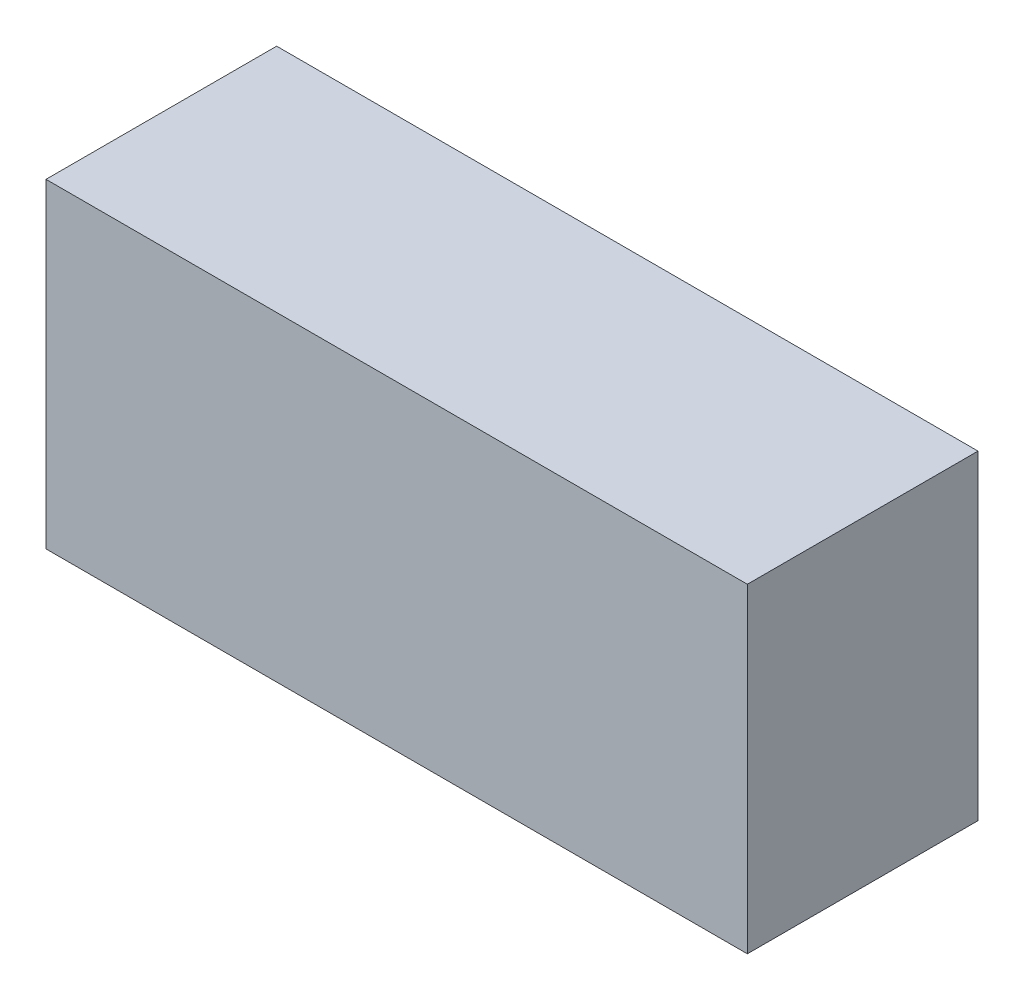
ISO-10303-21;
HEADER;
FILE_DESCRIPTION(('STEP AP214'),'2;1');
FILE_NAME('part.step','',(''),(''),'','','');
FILE_SCHEMA(('AUTOMOTIVE_DESIGN { 1 0 10303 214 1 1 1 1 }'));
ENDSEC;
DATA;
#1=APPLICATION_CONTEXT('core data for automotive mechanical design processes');
#2=APPLICATION_PROTOCOL_DEFINITION('international standard','automotive_design',2000,#1);
#3=PRODUCT_CONTEXT('',#1,'mechanical');
#4=PRODUCT('Part','Part','',(#3));
#5=PRODUCT_RELATED_PRODUCT_CATEGORY('part','',(#4));
#6=PRODUCT_DEFINITION_FORMATION('','',#4);
#7=PRODUCT_DEFINITION_CONTEXT('part definition',#1,'design');
#8=PRODUCT_DEFINITION('design','',#6,#7);
#9=PRODUCT_DEFINITION_SHAPE('','',#8);
#10=(LENGTH_UNIT() NAMED_UNIT(*) SI_UNIT(.MILLI.,.METRE.));
#11=(NAMED_UNIT(*) PLANE_ANGLE_UNIT() SI_UNIT($,.RADIAN.));
#12=(NAMED_UNIT(*) SI_UNIT($,.STERADIAN.) SOLID_ANGLE_UNIT());
#13=UNCERTAINTY_MEASURE_WITH_UNIT(LENGTH_MEASURE(1.E-05),#10,'distance_accuracy_value','');
#14=(GEOMETRIC_REPRESENTATION_CONTEXT(3) GLOBAL_UNCERTAINTY_ASSIGNED_CONTEXT((#13)) GLOBAL_UNIT_ASSIGNED_CONTEXT((#10,
#11,#12)) REPRESENTATION_CONTEXT('',''));
#15=CARTESIAN_POINT('',(0.,0.,0.));
#16=DIRECTION('',(0.,0.,1.));
#17=DIRECTION('',(1.,0.,0.));
#18=AXIS2_PLACEMENT_3D('',#15,#16,#17);
#19=CARTESIAN_POINT('',(-37.25,34.,-12.25));
#20=DIRECTION('',(1.,0.,0.));
#21=DIRECTION('',(0.,0.,-1.));
#22=AXIS2_PLACEMENT_3D('',#19,#20,#21);
#23=PLANE('',#22);
#24=DIRECTION('',(0.,0.,1.));
#25=VECTOR('',#24,1.);
#26=CARTESIAN_POINT('',(-37.25,0.,-12.25));
#27=LINE('',#26,#25);
#28=CARTESIAN_POINT('',(-37.25,0.,-12.25));
#29=VERTEX_POINT('',#28);
#30=CARTESIAN_POINT('',(-37.25,0.,12.25));
#31=VERTEX_POINT('',#30);
#32=EDGE_CURVE('E105',#29,#31,#27,.T.);
#33=ORIENTED_EDGE('',*,*,#32,.T.);
#34=DIRECTION('',(0.,-1.,0.));
#35=VECTOR('',#34,1.);
#36=CARTESIAN_POINT('',(-37.25,34.,12.25));
#37=LINE('',#36,#35);
#38=CARTESIAN_POINT('',(-37.25,34.,12.25));
#39=VERTEX_POINT('',#38);
#40=EDGE_CURVE('E11',#39,#31,#37,.T.);
#41=ORIENTED_EDGE('',*,*,#40,.F.);
#42=DIRECTION('',(0.,0.,1.));
#43=VECTOR('',#42,1.);
#44=CARTESIAN_POINT('',(-37.25,34.,-12.25));
#45=LINE('',#44,#43);
#46=CARTESIAN_POINT('',(-37.25,34.,-12.25));
#47=VERTEX_POINT('',#46);
#48=EDGE_CURVE('E93',#47,#39,#45,.T.);
#49=ORIENTED_EDGE('',*,*,#48,.F.);
#50=DIRECTION('',(0.,-1.,0.));
#51=VECTOR('',#50,1.);
#52=CARTESIAN_POINT('',(-37.25,34.,-12.25));
#53=LINE('',#52,#51);
#54=EDGE_CURVE('E101',#47,#29,#53,.T.);
#55=ORIENTED_EDGE('',*,*,#54,.T.);
#56=EDGE_LOOP('',(#33,#41,#49,#55));
#57=FACE_BOUND('',#56,.T.);
#58=ADVANCED_FACE('F42',(#57),#23,.F.);
#59=CARTESIAN_POINT('',(-37.25,34.,12.25));
#60=DIRECTION('',(0.,0.,-1.));
#61=DIRECTION('',(-1.,0.,0.));
#62=AXIS2_PLACEMENT_3D('',#59,#60,#61);
#63=PLANE('',#62);
#64=DIRECTION('',(1.,0.,0.));
#65=VECTOR('',#64,1.);
#66=CARTESIAN_POINT('',(-37.25,0.,12.25));
#67=LINE('',#66,#65);
#68=CARTESIAN_POINT('',(37.25,0.,12.25));
#69=VERTEX_POINT('',#68);
#70=EDGE_CURVE('E97',#31,#69,#67,.T.);
#71=ORIENTED_EDGE('',*,*,#70,.T.);
#72=DIRECTION('',(0.,-1.,0.));
#73=VECTOR('',#72,1.);
#74=CARTESIAN_POINT('',(37.25,34.,12.25));
#75=LINE('',#74,#73);
#76=CARTESIAN_POINT('',(37.25,34.,12.25));
#77=VERTEX_POINT('',#76);
#78=EDGE_CURVE('E50',#77,#69,#75,.T.);
#79=ORIENTED_EDGE('',*,*,#78,.F.);
#80=DIRECTION('',(1.,0.,0.));
#81=VECTOR('',#80,1.);
#82=CARTESIAN_POINT('',(-37.25,34.,12.25));
#83=LINE('',#82,#81);
#84=EDGE_CURVE('E88',#39,#77,#83,.T.);
#85=ORIENTED_EDGE('',*,*,#84,.F.);
#86=ORIENTED_EDGE('',*,*,#40,.T.);
#87=EDGE_LOOP('',(#71,#79,#85,#86));
#88=FACE_BOUND('',#87,.T.);
#89=ADVANCED_FACE('F96',(#88),#63,.F.);
#90=CARTESIAN_POINT('',(37.25,34.,-12.25));
#91=DIRECTION('',(-1.,0.,0.));
#92=DIRECTION('',(0.,0.,1.));
#93=AXIS2_PLACEMENT_3D('',#90,#91,#92);
#94=PLANE('',#93);
#95=DIRECTION('',(0.,0.,-1.));
#96=VECTOR('',#95,1.);
#97=CARTESIAN_POINT('',(37.25,0.,-12.25));
#98=LINE('',#97,#96);
#99=CARTESIAN_POINT('',(37.25,0.,-12.25));
#100=VERTEX_POINT('',#99);
#101=EDGE_CURVE('E75',#69,#100,#98,.T.);
#102=ORIENTED_EDGE('',*,*,#101,.T.);
#103=DIRECTION('',(0.,-1.,0.));
#104=VECTOR('',#103,1.);
#105=CARTESIAN_POINT('',(37.25,34.,-12.25));
#106=LINE('',#105,#104);
#107=CARTESIAN_POINT('',(37.25,34.,-12.25));
#108=VERTEX_POINT('',#107);
#109=EDGE_CURVE('E98',#108,#100,#106,.T.);
#110=ORIENTED_EDGE('',*,*,#109,.F.);
#111=DIRECTION('',(0.,0.,-1.));
#112=VECTOR('',#111,1.);
#113=CARTESIAN_POINT('',(37.25,34.,-12.25));
#114=LINE('',#113,#112);
#115=EDGE_CURVE('E91',#77,#108,#114,.T.);
#116=ORIENTED_EDGE('',*,*,#115,.F.);
#117=ORIENTED_EDGE('',*,*,#78,.T.);
#118=EDGE_LOOP('',(#102,#110,#116,#117));
#119=FACE_BOUND('',#118,.T.);
#120=ADVANCED_FACE('F99',(#119),#94,.F.);
#121=CARTESIAN_POINT('',(-37.25,34.,-12.25));
#122=DIRECTION('',(0.,0.,1.));
#123=DIRECTION('',(1.,0.,0.));
#124=AXIS2_PLACEMENT_3D('',#121,#122,#123);
#125=PLANE('',#124);
#126=DIRECTION('',(-1.,0.,0.));
#127=VECTOR('',#126,1.);
#128=CARTESIAN_POINT('',(-37.25,0.,-12.25));
#129=LINE('',#128,#127);
#130=EDGE_CURVE('E81',#100,#29,#129,.T.);
#131=ORIENTED_EDGE('',*,*,#130,.T.);
#132=ORIENTED_EDGE('',*,*,#54,.F.);
#133=DIRECTION('',(-1.,0.,0.));
#134=VECTOR('',#133,1.);
#135=CARTESIAN_POINT('',(-37.25,34.,-12.25));
#136=LINE('',#135,#134);
#137=EDGE_CURVE('E58',#108,#47,#136,.T.);
#138=ORIENTED_EDGE('',*,*,#137,.F.);
#139=ORIENTED_EDGE('',*,*,#109,.T.);
#140=EDGE_LOOP('',(#131,#132,#138,#139));
#141=FACE_BOUND('',#140,.T.);
#142=ADVANCED_FACE('F112',(#141),#125,.F.);
#143=CARTESIAN_POINT('',(0.,34.,0.));
#144=DIRECTION('',(0.,1.,0.));
#145=DIRECTION('',(0.,0.,1.));
#146=AXIS2_PLACEMENT_3D('',#143,#144,#145);
#147=PLANE('',#146);
#148=ORIENTED_EDGE('',*,*,#48,.T.);
#149=ORIENTED_EDGE('',*,*,#84,.T.);
#150=ORIENTED_EDGE('',*,*,#115,.T.);
#151=ORIENTED_EDGE('',*,*,#137,.T.);
#152=EDGE_LOOP('',(#148,#149,#150,#151));
#153=FACE_BOUND('',#152,.T.);
#154=ADVANCED_FACE('F89',(#153),#147,.T.);
#155=CARTESIAN_POINT('',(0.,0.,0.));
#156=DIRECTION('',(0.,1.,0.));
#157=DIRECTION('',(0.,0.,1.));
#158=AXIS2_PLACEMENT_3D('',#155,#156,#157);
#159=PLANE('',#158);
#160=ORIENTED_EDGE('',*,*,#32,.F.);
#161=ORIENTED_EDGE('',*,*,#130,.F.);
#162=ORIENTED_EDGE('',*,*,#101,.F.);
#163=ORIENTED_EDGE('',*,*,#70,.F.);
#164=EDGE_LOOP('',(#160,#161,#162,#163));
#165=FACE_BOUND('',#164,.T.);
#166=ADVANCED_FACE('F115',(#165),#159,.F.);
#167=CLOSED_SHELL('',(#58,#89,#120,#142,#154,#166));
#168=MANIFOLD_SOLID_BREP('B2',#167);
#169=ADVANCED_BREP_SHAPE_REPRESENTATION('',(#18,#168),#14);
#170=SHAPE_DEFINITION_REPRESENTATION(#9,#169);
ENDSEC;
END-ISO-10303-21;
